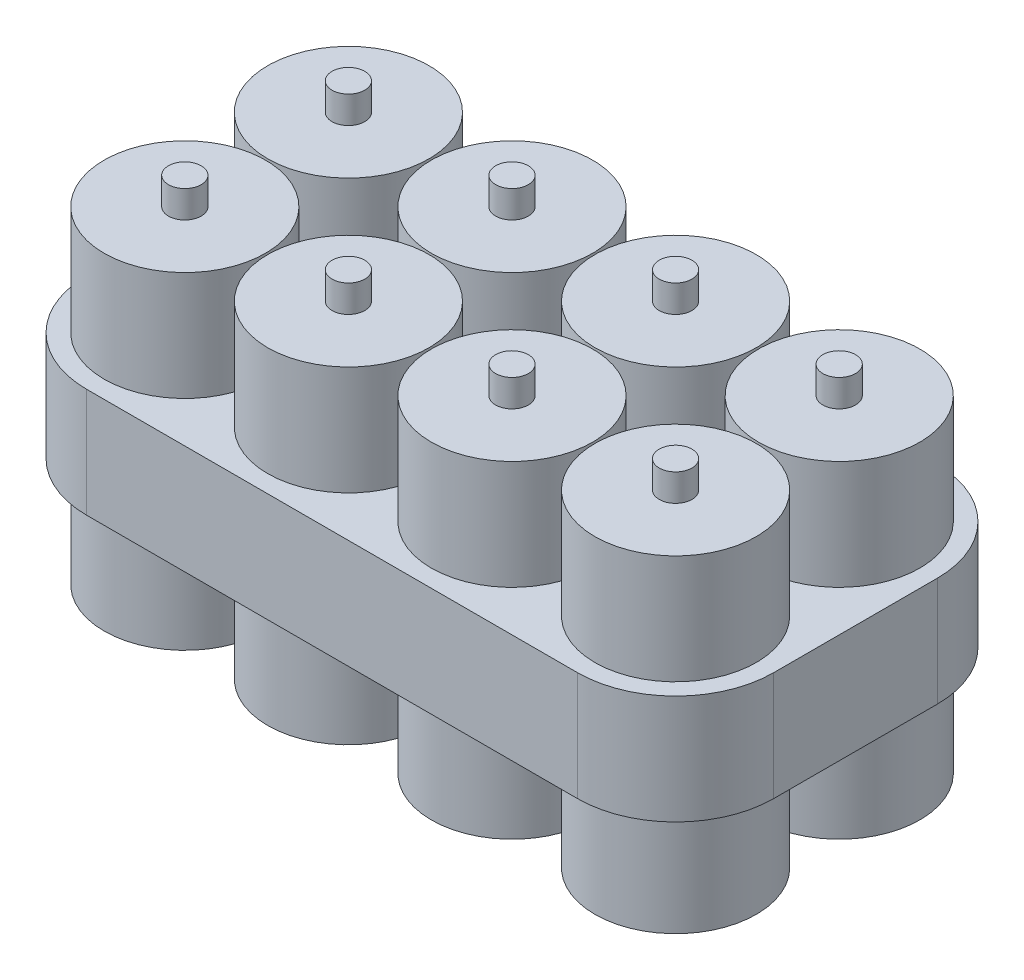
ISO-10303-21;
HEADER;
FILE_DESCRIPTION(('STEP AP214'),'2;1');
FILE_NAME('part.step','',(''),(''),'','','');
FILE_SCHEMA(('AUTOMOTIVE_DESIGN { 1 0 10303 214 1 1 1 1 }'));
ENDSEC;
DATA;
#1=APPLICATION_CONTEXT('core data for automotive mechanical design processes');
#2=APPLICATION_PROTOCOL_DEFINITION('international standard','automotive_design',2000,#1);
#3=PRODUCT_CONTEXT('',#1,'mechanical');
#4=PRODUCT('Part','Part','',(#3));
#5=PRODUCT_RELATED_PRODUCT_CATEGORY('part','',(#4));
#6=PRODUCT_DEFINITION_FORMATION('','',#4);
#7=PRODUCT_DEFINITION_CONTEXT('part definition',#1,'design');
#8=PRODUCT_DEFINITION('design','',#6,#7);
#9=PRODUCT_DEFINITION_SHAPE('','',#8);
#10=(LENGTH_UNIT() NAMED_UNIT(*) SI_UNIT(.MILLI.,.METRE.));
#11=(NAMED_UNIT(*) PLANE_ANGLE_UNIT() SI_UNIT($,.RADIAN.));
#12=(NAMED_UNIT(*) SI_UNIT($,.STERADIAN.) SOLID_ANGLE_UNIT());
#13=UNCERTAINTY_MEASURE_WITH_UNIT(LENGTH_MEASURE(1.E-05),#10,'distance_accuracy_value','');
#14=(GEOMETRIC_REPRESENTATION_CONTEXT(3) GLOBAL_UNCERTAINTY_ASSIGNED_CONTEXT((#13)) GLOBAL_UNIT_ASSIGNED_CONTEXT((#10,
#11,#12)) REPRESENTATION_CONTEXT('',''));
#15=CARTESIAN_POINT('',(0.,0.,0.));
#16=DIRECTION('',(0.,0.,1.));
#17=DIRECTION('',(1.,0.,0.));
#18=AXIS2_PLACEMENT_3D('',#15,#16,#17);
#19=CARTESIAN_POINT('',(0.,40.,0.));
#20=DIRECTION('',(0.,-1.,0.));
#21=DIRECTION('',(0.,0.,-1.));
#22=AXIS2_PLACEMENT_3D('',#19,#20,#21);
#23=CYLINDRICAL_SURFACE('',#22,18.);
#24=CARTESIAN_POINT('',(0.,20.,0.));
#25=DIRECTION('',(0.,1.,0.));
#26=DIRECTION('',(0.,0.,1.));
#27=AXIS2_PLACEMENT_3D('',#24,#25,#26);
#28=CIRCLE('',#27,18.);
#29=CARTESIAN_POINT('',(0.,20.,18.));
#30=VERTEX_POINT('',#29);
#31=CARTESIAN_POINT('',(-18.,20.,1.047339298621E-13));
#32=VERTEX_POINT('',#31);
#33=EDGE_CURVE('E136',#30,#32,#28,.F.);
#34=ORIENTED_EDGE('',*,*,#33,.F.);
#35=DIRECTION('',(0.,-1.,0.));
#36=VECTOR('',#35,1.);
#37=CARTESIAN_POINT('',(0.,40.,18.));
#38=LINE('',#37,#36);
#39=CARTESIAN_POINT('',(0.,40.,18.));
#40=VERTEX_POINT('',#39);
#41=EDGE_CURVE('E95',#40,#30,#38,.T.);
#42=ORIENTED_EDGE('',*,*,#41,.F.);
#43=CARTESIAN_POINT('',(0.,40.,0.));
#44=DIRECTION('',(0.,1.,0.));
#45=DIRECTION('',(0.,0.,1.));
#46=AXIS2_PLACEMENT_3D('',#43,#44,#45);
#47=CIRCLE('',#46,18.);
#48=CARTESIAN_POINT('',(-18.,40.,1.047339298621E-13));
#49=VERTEX_POINT('',#48);
#50=EDGE_CURVE('E156',#40,#49,#47,.F.);
#51=ORIENTED_EDGE('',*,*,#50,.T.);
#52=DIRECTION('',(0.,-1.,0.));
#53=VECTOR('',#52,1.);
#54=CARTESIAN_POINT('',(-18.,40.,1.047339298621E-13));
#55=LINE('',#54,#53);
#56=EDGE_CURVE('E90',#49,#32,#55,.T.);
#57=ORIENTED_EDGE('',*,*,#56,.T.);
#58=EDGE_LOOP('',(#34,#42,#51,#57));
#59=FACE_BOUND('',#58,.T.);
#60=ADVANCED_FACE('F37',(#59),#23,.T.);
#61=CARTESIAN_POINT('',(0.,40.,18.));
#62=DIRECTION('',(0.,0.,-1.));
#63=DIRECTION('',(-1.,0.,0.));
#64=AXIS2_PLACEMENT_3D('',#61,#62,#63);
#65=PLANE('',#64);
#66=DIRECTION('',(1.,0.,0.));
#67=VECTOR('',#66,1.);
#68=CARTESIAN_POINT('',(0.,20.,18.));
#69=LINE('',#68,#67);
#70=CARTESIAN_POINT('',(90.,20.,18.));
#71=VERTEX_POINT('',#70);
#72=EDGE_CURVE('E139',#30,#71,#69,.T.);
#73=ORIENTED_EDGE('',*,*,#72,.T.);
#74=DIRECTION('',(0.,-1.,0.));
#75=VECTOR('',#74,1.);
#76=CARTESIAN_POINT('',(90.,40.,18.));
#77=LINE('',#76,#75);
#78=CARTESIAN_POINT('',(90.,40.,18.));
#79=VERTEX_POINT('',#78);
#80=EDGE_CURVE('E164',#79,#71,#77,.T.);
#81=ORIENTED_EDGE('',*,*,#80,.F.);
#82=DIRECTION('',(1.,0.,0.));
#83=VECTOR('',#82,1.);
#84=CARTESIAN_POINT('',(0.,40.,18.));
#85=LINE('',#84,#83);
#86=EDGE_CURVE('E275',#40,#79,#85,.T.);
#87=ORIENTED_EDGE('',*,*,#86,.F.);
#88=ORIENTED_EDGE('',*,*,#41,.T.);
#89=EDGE_LOOP('',(#73,#81,#87,#88));
#90=FACE_BOUND('',#89,.T.);
#91=ADVANCED_FACE('F296',(#90),#65,.F.);
#92=CARTESIAN_POINT('',(90.,40.,0.));
#93=DIRECTION('',(0.,-1.,0.));
#94=DIRECTION('',(0.,0.,-1.));
#95=AXIS2_PLACEMENT_3D('',#92,#93,#94);
#96=CYLINDRICAL_SURFACE('',#95,18.);
#97=CARTESIAN_POINT('',(90.,20.,0.));
#98=DIRECTION('',(0.,1.,0.));
#99=DIRECTION('',(0.,0.,1.));
#100=AXIS2_PLACEMENT_3D('',#97,#98,#99);
#101=CIRCLE('',#100,18.);
#102=CARTESIAN_POINT('',(108.,20.,0.));
#103=VERTEX_POINT('',#102);
#104=EDGE_CURVE('E143',#103,#71,#101,.F.);
#105=ORIENTED_EDGE('',*,*,#104,.F.);
#106=DIRECTION('',(0.,-1.,0.));
#107=VECTOR('',#106,1.);
#108=CARTESIAN_POINT('',(108.,40.,0.));
#109=LINE('',#108,#107);
#110=CARTESIAN_POINT('',(108.,40.,0.));
#111=VERTEX_POINT('',#110);
#112=EDGE_CURVE('E162',#111,#103,#109,.T.);
#113=ORIENTED_EDGE('',*,*,#112,.F.);
#114=CARTESIAN_POINT('',(90.,40.,0.));
#115=DIRECTION('',(0.,1.,0.));
#116=DIRECTION('',(0.,0.,1.));
#117=AXIS2_PLACEMENT_3D('',#114,#115,#116);
#118=CIRCLE('',#117,18.);
#119=EDGE_CURVE('E277',#111,#79,#118,.F.);
#120=ORIENTED_EDGE('',*,*,#119,.T.);
#121=ORIENTED_EDGE('',*,*,#80,.T.);
#122=EDGE_LOOP('',(#105,#113,#120,#121));
#123=FACE_BOUND('',#122,.T.);
#124=ADVANCED_FACE('F298',(#123),#96,.T.);
#125=CARTESIAN_POINT('',(108.,40.,0.));
#126=DIRECTION('',(1.,0.,0.));
#127=DIRECTION('',(0.,0.,-1.));
#128=AXIS2_PLACEMENT_3D('',#125,#126,#127);
#129=PLANE('',#128);
#130=DIRECTION('',(0.,0.,1.));
#131=VECTOR('',#130,1.);
#132=CARTESIAN_POINT('',(108.,20.,0.));
#133=LINE('',#132,#131);
#134=CARTESIAN_POINT('',(108.,20.,-30.));
#135=VERTEX_POINT('',#134);
#136=EDGE_CURVE('E146',#135,#103,#133,.T.);
#137=ORIENTED_EDGE('',*,*,#136,.F.);
#138=DIRECTION('',(0.,-1.,0.));
#139=VECTOR('',#138,1.);
#140=CARTESIAN_POINT('',(108.,40.,-30.));
#141=LINE('',#140,#139);
#142=CARTESIAN_POINT('',(108.,40.,-30.));
#143=VERTEX_POINT('',#142);
#144=EDGE_CURVE('E160',#143,#135,#141,.T.);
#145=ORIENTED_EDGE('',*,*,#144,.F.);
#146=DIRECTION('',(0.,0.,1.));
#147=VECTOR('',#146,1.);
#148=CARTESIAN_POINT('',(108.,40.,0.));
#149=LINE('',#148,#147);
#150=EDGE_CURVE('E131',#143,#111,#149,.T.);
#151=ORIENTED_EDGE('',*,*,#150,.T.);
#152=ORIENTED_EDGE('',*,*,#112,.T.);
#153=EDGE_LOOP('',(#137,#145,#151,#152));
#154=FACE_BOUND('',#153,.T.);
#155=ADVANCED_FACE('F282',(#154),#129,.T.);
#156=CARTESIAN_POINT('',(90.,40.,-30.));
#157=DIRECTION('',(0.,-1.,0.));
#158=DIRECTION('',(0.,0.,-1.));
#159=AXIS2_PLACEMENT_3D('',#156,#157,#158);
#160=CYLINDRICAL_SURFACE('',#159,18.);
#161=CARTESIAN_POINT('',(90.,20.,-30.));
#162=DIRECTION('',(0.,1.,0.));
#163=DIRECTION('',(0.,0.,1.));
#164=AXIS2_PLACEMENT_3D('',#161,#162,#163);
#165=CIRCLE('',#164,18.);
#166=CARTESIAN_POINT('',(90.,20.,-48.));
#167=VERTEX_POINT('',#166);
#168=EDGE_CURVE('E149',#167,#135,#165,.F.);
#169=ORIENTED_EDGE('',*,*,#168,.F.);
#170=DIRECTION('',(0.,-1.,0.));
#171=VECTOR('',#170,1.);
#172=CARTESIAN_POINT('',(90.,40.,-48.));
#173=LINE('',#172,#171);
#174=CARTESIAN_POINT('',(90.,40.,-48.));
#175=VERTEX_POINT('',#174);
#176=EDGE_CURVE('E119',#175,#167,#173,.T.);
#177=ORIENTED_EDGE('',*,*,#176,.F.);
#178=CARTESIAN_POINT('',(90.,40.,-30.));
#179=DIRECTION('',(0.,1.,0.));
#180=DIRECTION('',(0.,0.,1.));
#181=AXIS2_PLACEMENT_3D('',#178,#179,#180);
#182=CIRCLE('',#181,18.);
#183=EDGE_CURVE('E129',#175,#143,#182,.F.);
#184=ORIENTED_EDGE('',*,*,#183,.T.);
#185=ORIENTED_EDGE('',*,*,#144,.T.);
#186=EDGE_LOOP('',(#169,#177,#184,#185));
#187=FACE_BOUND('',#186,.T.);
#188=ADVANCED_FACE('F287',(#187),#160,.T.);
#189=CARTESIAN_POINT('',(0.,40.,-48.));
#190=DIRECTION('',(0.,0.,-1.));
#191=DIRECTION('',(-1.,0.,0.));
#192=AXIS2_PLACEMENT_3D('',#189,#190,#191);
#193=PLANE('',#192);
#194=DIRECTION('',(1.,0.,0.));
#195=VECTOR('',#194,1.);
#196=CARTESIAN_POINT('',(0.,20.,-48.));
#197=LINE('',#196,#195);
#198=CARTESIAN_POINT('',(0.,20.,-48.));
#199=VERTEX_POINT('',#198);
#200=EDGE_CURVE('E118',#199,#167,#197,.T.);
#201=ORIENTED_EDGE('',*,*,#200,.F.);
#202=DIRECTION('',(0.,-1.,0.));
#203=VECTOR('',#202,1.);
#204=CARTESIAN_POINT('',(0.,40.,-48.));
#205=LINE('',#204,#203);
#206=CARTESIAN_POINT('',(0.,40.,-48.));
#207=VERTEX_POINT('',#206);
#208=EDGE_CURVE('E112',#207,#199,#205,.T.);
#209=ORIENTED_EDGE('',*,*,#208,.F.);
#210=DIRECTION('',(1.,0.,0.));
#211=VECTOR('',#210,1.);
#212=CARTESIAN_POINT('',(0.,40.,-48.));
#213=LINE('',#212,#211);
#214=EDGE_CURVE('E116',#207,#175,#213,.T.);
#215=ORIENTED_EDGE('',*,*,#214,.T.);
#216=ORIENTED_EDGE('',*,*,#176,.T.);
#217=EDGE_LOOP('',(#201,#209,#215,#216));
#218=FACE_BOUND('',#217,.T.);
#219=ADVANCED_FACE('F114',(#218),#193,.T.);
#220=CARTESIAN_POINT('',(0.,40.,-30.));
#221=DIRECTION('',(0.,-1.,0.));
#222=DIRECTION('',(0.,0.,-1.));
#223=AXIS2_PLACEMENT_3D('',#220,#221,#222);
#224=CYLINDRICAL_SURFACE('',#223,18.);
#225=CARTESIAN_POINT('',(0.,20.,-30.));
#226=DIRECTION('',(0.,1.,0.));
#227=DIRECTION('',(0.,0.,1.));
#228=AXIS2_PLACEMENT_3D('',#225,#226,#227);
#229=CIRCLE('',#228,18.);
#230=CARTESIAN_POINT('',(-18.,20.,-30.));
#231=VERTEX_POINT('',#230);
#232=EDGE_CURVE('E83',#199,#231,#229,.T.);
#233=ORIENTED_EDGE('',*,*,#232,.T.);
#234=DIRECTION('',(0.,-1.,0.));
#235=VECTOR('',#234,1.);
#236=CARTESIAN_POINT('',(-18.,40.,-30.));
#237=LINE('',#236,#235);
#238=CARTESIAN_POINT('',(-18.,40.,-30.));
#239=VERTEX_POINT('',#238);
#240=EDGE_CURVE('E120',#239,#231,#237,.T.);
#241=ORIENTED_EDGE('',*,*,#240,.F.);
#242=CARTESIAN_POINT('',(0.,40.,-30.));
#243=DIRECTION('',(0.,1.,0.));
#244=DIRECTION('',(0.,0.,1.));
#245=AXIS2_PLACEMENT_3D('',#242,#243,#244);
#246=CIRCLE('',#245,18.);
#247=EDGE_CURVE('E122',#207,#239,#246,.T.);
#248=ORIENTED_EDGE('',*,*,#247,.F.);
#249=ORIENTED_EDGE('',*,*,#208,.T.);
#250=EDGE_LOOP('',(#233,#241,#248,#249));
#251=FACE_BOUND('',#250,.T.);
#252=ADVANCED_FACE('F123',(#251),#224,.T.);
#253=CARTESIAN_POINT('',(-18.,40.,0.));
#254=DIRECTION('',(1.,0.,0.));
#255=DIRECTION('',(0.,0.,-1.));
#256=AXIS2_PLACEMENT_3D('',#253,#254,#255);
#257=PLANE('',#256);
#258=DIRECTION('',(0.,0.,1.));
#259=VECTOR('',#258,1.);
#260=CARTESIAN_POINT('',(-18.,20.,0.));
#261=LINE('',#260,#259);
#262=EDGE_CURVE('E154',#231,#32,#261,.T.);
#263=ORIENTED_EDGE('',*,*,#262,.T.);
#264=ORIENTED_EDGE('',*,*,#56,.F.);
#265=DIRECTION('',(0.,0.,1.));
#266=VECTOR('',#265,1.);
#267=CARTESIAN_POINT('',(-18.,40.,0.));
#268=LINE('',#267,#266);
#269=EDGE_CURVE('E55',#239,#49,#268,.T.);
#270=ORIENTED_EDGE('',*,*,#269,.F.);
#271=ORIENTED_EDGE('',*,*,#240,.T.);
#272=EDGE_LOOP('',(#263,#264,#270,#271));
#273=FACE_BOUND('',#272,.T.);
#274=ADVANCED_FACE('F293',(#273),#257,.F.);
#275=CARTESIAN_POINT('',(0.,40.,0.));
#276=DIRECTION('',(0.,1.,0.));
#277=DIRECTION('',(0.,0.,1.));
#278=AXIS2_PLACEMENT_3D('',#275,#276,#277);
#279=PLANE('',#278);
#280=CARTESIAN_POINT('',(0.,40.,0.));
#281=DIRECTION('',(0.,1.,0.));
#282=DIRECTION('',(0.,0.,1.));
#283=AXIS2_PLACEMENT_3D('',#280,#281,#282);
#284=CIRCLE('',#283,14.8);
#285=CARTESIAN_POINT('',(0.,40.,14.8));
#286=VERTEX_POINT('',#285);
#287=EDGE_CURVE('E206',#286,#286,#284,.F.);
#288=ORIENTED_EDGE('',*,*,#287,.T.);
#289=EDGE_LOOP('',(#288));
#290=FACE_BOUND('',#289,.T.);
#291=CARTESIAN_POINT('',(30.,40.,0.));
#292=DIRECTION('',(0.,1.,0.));
#293=DIRECTION('',(0.,0.,1.));
#294=AXIS2_PLACEMENT_3D('',#291,#292,#293);
#295=CIRCLE('',#294,14.8);
#296=CARTESIAN_POINT('',(30.,40.,14.8));
#297=VERTEX_POINT('',#296);
#298=EDGE_CURVE('E216',#297,#297,#295,.F.);
#299=ORIENTED_EDGE('',*,*,#298,.T.);
#300=EDGE_LOOP('',(#299));
#301=FACE_BOUND('',#300,.T.);
#302=CARTESIAN_POINT('',(60.,40.,0.));
#303=DIRECTION('',(0.,1.,0.));
#304=DIRECTION('',(0.,0.,1.));
#305=AXIS2_PLACEMENT_3D('',#302,#303,#304);
#306=CIRCLE('',#305,14.8);
#307=CARTESIAN_POINT('',(60.,40.,14.8));
#308=VERTEX_POINT('',#307);
#309=EDGE_CURVE('E225',#308,#308,#306,.F.);
#310=ORIENTED_EDGE('',*,*,#309,.T.);
#311=EDGE_LOOP('',(#310));
#312=FACE_BOUND('',#311,.T.);
#313=CARTESIAN_POINT('',(90.,40.,0.));
#314=DIRECTION('',(0.,1.,0.));
#315=DIRECTION('',(0.,0.,1.));
#316=AXIS2_PLACEMENT_3D('',#313,#314,#315);
#317=CIRCLE('',#316,14.8);
#318=CARTESIAN_POINT('',(90.,40.,14.8));
#319=VERTEX_POINT('',#318);
#320=EDGE_CURVE('E234',#319,#319,#317,.F.);
#321=ORIENTED_EDGE('',*,*,#320,.T.);
#322=EDGE_LOOP('',(#321));
#323=FACE_BOUND('',#322,.T.);
#324=CARTESIAN_POINT('',(90.,40.,-30.));
#325=DIRECTION('',(0.,1.,0.));
#326=DIRECTION('',(0.,0.,1.));
#327=AXIS2_PLACEMENT_3D('',#324,#325,#326);
#328=CIRCLE('',#327,14.8);
#329=CARTESIAN_POINT('',(90.,40.,-15.2));
#330=VERTEX_POINT('',#329);
#331=EDGE_CURVE('E243',#330,#330,#328,.F.);
#332=ORIENTED_EDGE('',*,*,#331,.T.);
#333=EDGE_LOOP('',(#332));
#334=FACE_BOUND('',#333,.T.);
#335=CARTESIAN_POINT('',(60.,40.,-30.));
#336=DIRECTION('',(0.,1.,0.));
#337=DIRECTION('',(0.,0.,1.));
#338=AXIS2_PLACEMENT_3D('',#335,#336,#337);
#339=CIRCLE('',#338,14.8);
#340=CARTESIAN_POINT('',(60.,40.,-15.2));
#341=VERTEX_POINT('',#340);
#342=EDGE_CURVE('E252',#341,#341,#339,.F.);
#343=ORIENTED_EDGE('',*,*,#342,.T.);
#344=EDGE_LOOP('',(#343));
#345=FACE_BOUND('',#344,.T.);
#346=CARTESIAN_POINT('',(30.,40.,-30.));
#347=DIRECTION('',(0.,1.,0.));
#348=DIRECTION('',(0.,0.,1.));
#349=AXIS2_PLACEMENT_3D('',#346,#347,#348);
#350=CIRCLE('',#349,14.8);
#351=CARTESIAN_POINT('',(30.,40.,-15.2));
#352=VERTEX_POINT('',#351);
#353=EDGE_CURVE('E261',#352,#352,#350,.F.);
#354=ORIENTED_EDGE('',*,*,#353,.T.);
#355=EDGE_LOOP('',(#354));
#356=FACE_BOUND('',#355,.T.);
#357=CARTESIAN_POINT('',(0.,40.,-30.));
#358=DIRECTION('',(0.,1.,0.));
#359=DIRECTION('',(0.,0.,1.));
#360=AXIS2_PLACEMENT_3D('',#357,#358,#359);
#361=CIRCLE('',#360,14.8);
#362=CARTESIAN_POINT('',(0.,40.,-15.2));
#363=VERTEX_POINT('',#362);
#364=EDGE_CURVE('E140',#363,#363,#361,.F.);
#365=ORIENTED_EDGE('',*,*,#364,.T.);
#366=EDGE_LOOP('',(#365));
#367=FACE_BOUND('',#366,.T.);
#368=ORIENTED_EDGE('',*,*,#50,.F.);
#369=ORIENTED_EDGE('',*,*,#86,.T.);
#370=ORIENTED_EDGE('',*,*,#119,.F.);
#371=ORIENTED_EDGE('',*,*,#150,.F.);
#372=ORIENTED_EDGE('',*,*,#183,.F.);
#373=ORIENTED_EDGE('',*,*,#214,.F.);
#374=ORIENTED_EDGE('',*,*,#247,.T.);
#375=ORIENTED_EDGE('',*,*,#269,.T.);
#376=EDGE_LOOP('',(#368,#369,#370,#371,#372,#373,#374,#375));
#377=FACE_BOUND('',#376,.T.);
#378=ADVANCED_FACE('F126',(#290,#301,#312,#323,#334,#345,#356,#367,#377),#279,.T.);
#379=CARTESIAN_POINT('',(0.,20.,0.));
#380=DIRECTION('',(0.,1.,0.));
#381=DIRECTION('',(0.,0.,1.));
#382=AXIS2_PLACEMENT_3D('',#379,#380,#381);
#383=PLANE('',#382);
#384=CARTESIAN_POINT('',(0.,20.,0.));
#385=DIRECTION('',(0.,1.,0.));
#386=DIRECTION('',(0.,0.,1.));
#387=AXIS2_PLACEMENT_3D('',#384,#385,#386);
#388=CIRCLE('',#387,14.8);
#389=CARTESIAN_POINT('',(0.,20.,14.8));
#390=VERTEX_POINT('',#389);
#391=EDGE_CURVE('E40',#390,#390,#388,.F.);
#392=ORIENTED_EDGE('',*,*,#391,.F.);
#393=EDGE_LOOP('',(#392));
#394=FACE_BOUND('',#393,.T.);
#395=CARTESIAN_POINT('',(30.,20.,0.));
#396=DIRECTION('',(0.,1.,0.));
#397=DIRECTION('',(0.,0.,1.));
#398=AXIS2_PLACEMENT_3D('',#395,#396,#397);
#399=CIRCLE('',#398,14.8);
#400=CARTESIAN_POINT('',(30.,20.,14.8));
#401=VERTEX_POINT('',#400);
#402=EDGE_CURVE('E184',#401,#401,#399,.F.);
#403=ORIENTED_EDGE('',*,*,#402,.F.);
#404=EDGE_LOOP('',(#403));
#405=FACE_BOUND('',#404,.T.);
#406=CARTESIAN_POINT('',(60.,20.,0.));
#407=DIRECTION('',(0.,1.,0.));
#408=DIRECTION('',(0.,0.,1.));
#409=AXIS2_PLACEMENT_3D('',#406,#407,#408);
#410=CIRCLE('',#409,14.8);
#411=CARTESIAN_POINT('',(60.,20.,14.8));
#412=VERTEX_POINT('',#411);
#413=EDGE_CURVE('E182',#412,#412,#410,.F.);
#414=ORIENTED_EDGE('',*,*,#413,.F.);
#415=EDGE_LOOP('',(#414));
#416=FACE_BOUND('',#415,.T.);
#417=CARTESIAN_POINT('',(90.,20.,0.));
#418=DIRECTION('',(0.,1.,0.));
#419=DIRECTION('',(0.,0.,1.));
#420=AXIS2_PLACEMENT_3D('',#417,#418,#419);
#421=CIRCLE('',#420,14.8);
#422=CARTESIAN_POINT('',(90.,20.,14.8));
#423=VERTEX_POINT('',#422);
#424=EDGE_CURVE('E179',#423,#423,#421,.F.);
#425=ORIENTED_EDGE('',*,*,#424,.F.);
#426=EDGE_LOOP('',(#425));
#427=FACE_BOUND('',#426,.T.);
#428=CARTESIAN_POINT('',(90.,20.,-30.));
#429=DIRECTION('',(0.,1.,0.));
#430=DIRECTION('',(0.,0.,1.));
#431=AXIS2_PLACEMENT_3D('',#428,#429,#430);
#432=CIRCLE('',#431,14.8);
#433=CARTESIAN_POINT('',(90.,20.,-15.2));
#434=VERTEX_POINT('',#433);
#435=EDGE_CURVE('E176',#434,#434,#432,.F.);
#436=ORIENTED_EDGE('',*,*,#435,.F.);
#437=EDGE_LOOP('',(#436));
#438=FACE_BOUND('',#437,.T.);
#439=CARTESIAN_POINT('',(60.,20.,-30.));
#440=DIRECTION('',(0.,1.,0.));
#441=DIRECTION('',(0.,0.,1.));
#442=AXIS2_PLACEMENT_3D('',#439,#440,#441);
#443=CIRCLE('',#442,14.8);
#444=CARTESIAN_POINT('',(60.,20.,-15.2));
#445=VERTEX_POINT('',#444);
#446=EDGE_CURVE('E173',#445,#445,#443,.F.);
#447=ORIENTED_EDGE('',*,*,#446,.F.);
#448=EDGE_LOOP('',(#447));
#449=FACE_BOUND('',#448,.T.);
#450=CARTESIAN_POINT('',(30.,20.,-30.));
#451=DIRECTION('',(0.,1.,0.));
#452=DIRECTION('',(0.,0.,1.));
#453=AXIS2_PLACEMENT_3D('',#450,#451,#452);
#454=CIRCLE('',#453,14.8);
#455=CARTESIAN_POINT('',(30.,20.,-15.2));
#456=VERTEX_POINT('',#455);
#457=EDGE_CURVE('E170',#456,#456,#454,.F.);
#458=ORIENTED_EDGE('',*,*,#457,.F.);
#459=EDGE_LOOP('',(#458));
#460=FACE_BOUND('',#459,.T.);
#461=CARTESIAN_POINT('',(0.,20.,-30.));
#462=DIRECTION('',(0.,1.,0.));
#463=DIRECTION('',(0.,0.,1.));
#464=AXIS2_PLACEMENT_3D('',#461,#462,#463);
#465=CIRCLE('',#464,14.8);
#466=CARTESIAN_POINT('',(0.,20.,-15.2));
#467=VERTEX_POINT('',#466);
#468=EDGE_CURVE('E167',#467,#467,#465,.F.);
#469=ORIENTED_EDGE('',*,*,#468,.F.);
#470=EDGE_LOOP('',(#469));
#471=FACE_BOUND('',#470,.T.);
#472=ORIENTED_EDGE('',*,*,#33,.T.);
#473=ORIENTED_EDGE('',*,*,#262,.F.);
#474=ORIENTED_EDGE('',*,*,#232,.F.);
#475=ORIENTED_EDGE('',*,*,#200,.T.);
#476=ORIENTED_EDGE('',*,*,#168,.T.);
#477=ORIENTED_EDGE('',*,*,#136,.T.);
#478=ORIENTED_EDGE('',*,*,#104,.T.);
#479=ORIENTED_EDGE('',*,*,#72,.F.);
#480=EDGE_LOOP('',(#472,#473,#474,#475,#476,#477,#478,#479));
#481=FACE_BOUND('',#480,.T.);
#482=ADVANCED_FACE('F289',(#394,#405,#416,#427,#438,#449,#460,#471,#481),#383,.F.);
#483=CARTESIAN_POINT('',(0.,0.,0.));
#484=DIRECTION('',(0.,1.,0.));
#485=DIRECTION('',(0.,0.,1.));
#486=AXIS2_PLACEMENT_3D('',#483,#484,#485);
#487=PLANE('',#486);
#488=CARTESIAN_POINT('',(0.,0.,-30.));
#489=DIRECTION('',(0.,1.,0.));
#490=DIRECTION('',(0.,0.,1.));
#491=AXIS2_PLACEMENT_3D('',#488,#489,#490);
#492=CIRCLE('',#491,14.8);
#493=CARTESIAN_POINT('',(0.,0.,-15.2));
#494=VERTEX_POINT('',#493);
#495=EDGE_CURVE('E266',#494,#494,#492,.T.);
#496=ORIENTED_EDGE('',*,*,#495,.F.);
#497=EDGE_LOOP('',(#496));
#498=FACE_BOUND('',#497,.T.);
#499=ADVANCED_FACE('F373',(#498),#487,.F.);
#500=CARTESIAN_POINT('',(0.,60.,-30.));
#501=DIRECTION('',(0.,-1.,0.));
#502=DIRECTION('',(0.,0.,-1.));
#503=AXIS2_PLACEMENT_3D('',#500,#501,#502);
#504=CYLINDRICAL_SURFACE('',#503,14.8);
#505=ORIENTED_EDGE('',*,*,#495,.T.);
#506=EDGE_LOOP('',(#505));
#507=FACE_BOUND('',#506,.T.);
#508=ORIENTED_EDGE('',*,*,#468,.T.);
#509=EDGE_LOOP('',(#508));
#510=FACE_BOUND('',#509,.T.);
#511=ADVANCED_FACE('F383',(#507,#510),#504,.T.);
#512=ORIENTED_EDGE('',*,*,#364,.F.);
#513=EDGE_LOOP('',(#512));
#514=FACE_BOUND('',#513,.T.);
#515=CARTESIAN_POINT('',(0.,60.,-30.));
#516=DIRECTION('',(0.,1.,0.));
#517=DIRECTION('',(0.,0.,1.));
#518=AXIS2_PLACEMENT_3D('',#515,#516,#517);
#519=CIRCLE('',#518,14.8);
#520=CARTESIAN_POINT('',(0.,60.,-15.2));
#521=VERTEX_POINT('',#520);
#522=EDGE_CURVE('E267',#521,#521,#519,.T.);
#523=ORIENTED_EDGE('',*,*,#522,.F.);
#524=EDGE_LOOP('',(#523));
#525=FACE_BOUND('',#524,.T.);
#526=ADVANCED_FACE('F393',(#514,#525),#504,.T.);
#527=CARTESIAN_POINT('',(0.,60.,0.));
#528=DIRECTION('',(0.,1.,0.));
#529=DIRECTION('',(0.,0.,1.));
#530=AXIS2_PLACEMENT_3D('',#527,#528,#529);
#531=PLANE('',#530);
#532=CARTESIAN_POINT('',(0.,60.,-30.));
#533=DIRECTION('',(0.,1.,0.));
#534=DIRECTION('',(0.,0.,1.));
#535=AXIS2_PLACEMENT_3D('',#532,#533,#534);
#536=CIRCLE('',#535,3.);
#537=CARTESIAN_POINT('',(0.,60.,-27.));
#538=VERTEX_POINT('',#537);
#539=EDGE_CURVE('E189',#538,#538,#536,.T.);
#540=ORIENTED_EDGE('',*,*,#539,.F.);
#541=EDGE_LOOP('',(#540));
#542=FACE_BOUND('',#541,.T.);
#543=ORIENTED_EDGE('',*,*,#522,.T.);
#544=EDGE_LOOP('',(#543));
#545=FACE_BOUND('',#544,.T.);
#546=ADVANCED_FACE('F403',(#542,#545),#531,.T.);
#547=CARTESIAN_POINT('',(0.,0.,0.));
#548=DIRECTION('',(0.,1.,0.));
#549=DIRECTION('',(0.,0.,1.));
#550=AXIS2_PLACEMENT_3D('',#547,#548,#549);
#551=PLANE('',#550);
#552=CARTESIAN_POINT('',(30.,0.,-30.));
#553=DIRECTION('',(0.,1.,0.));
#554=DIRECTION('',(0.,0.,1.));
#555=AXIS2_PLACEMENT_3D('',#552,#553,#554);
#556=CIRCLE('',#555,14.8);
#557=CARTESIAN_POINT('',(30.,0.,-15.2));
#558=VERTEX_POINT('',#557);
#559=EDGE_CURVE('E257',#558,#558,#556,.T.);
#560=ORIENTED_EDGE('',*,*,#559,.F.);
#561=EDGE_LOOP('',(#560));
#562=FACE_BOUND('',#561,.T.);
#563=ADVANCED_FACE('F410',(#562),#551,.F.);
#564=CARTESIAN_POINT('',(30.,60.,-30.));
#565=DIRECTION('',(0.,-1.,0.));
#566=DIRECTION('',(0.,0.,-1.));
#567=AXIS2_PLACEMENT_3D('',#564,#565,#566);
#568=CYLINDRICAL_SURFACE('',#567,14.8);
#569=ORIENTED_EDGE('',*,*,#559,.T.);
#570=EDGE_LOOP('',(#569));
#571=FACE_BOUND('',#570,.T.);
#572=ORIENTED_EDGE('',*,*,#457,.T.);
#573=EDGE_LOOP('',(#572));
#574=FACE_BOUND('',#573,.T.);
#575=ADVANCED_FACE('F415',(#571,#574),#568,.T.);
#576=ORIENTED_EDGE('',*,*,#353,.F.);
#577=EDGE_LOOP('',(#576));
#578=FACE_BOUND('',#577,.T.);
#579=CARTESIAN_POINT('',(30.,60.,-30.));
#580=DIRECTION('',(0.,1.,0.));
#581=DIRECTION('',(0.,0.,1.));
#582=AXIS2_PLACEMENT_3D('',#579,#580,#581);
#583=CIRCLE('',#582,14.8);
#584=CARTESIAN_POINT('',(30.,60.,-15.2));
#585=VERTEX_POINT('',#584);
#586=EDGE_CURVE('E258',#585,#585,#583,.T.);
#587=ORIENTED_EDGE('',*,*,#586,.F.);
#588=EDGE_LOOP('',(#587));
#589=FACE_BOUND('',#588,.T.);
#590=ADVANCED_FACE('F425',(#578,#589),#568,.T.);
#591=CARTESIAN_POINT('',(0.,60.,0.));
#592=DIRECTION('',(0.,1.,0.));
#593=DIRECTION('',(0.,0.,1.));
#594=AXIS2_PLACEMENT_3D('',#591,#592,#593);
#595=PLANE('',#594);
#596=CARTESIAN_POINT('',(30.,60.,-30.));
#597=DIRECTION('',(0.,1.,0.));
#598=DIRECTION('',(0.,0.,1.));
#599=AXIS2_PLACEMENT_3D('',#596,#597,#598);
#600=CIRCLE('',#599,3.);
#601=CARTESIAN_POINT('',(30.,60.,-27.));
#602=VERTEX_POINT('',#601);
#603=EDGE_CURVE('E193',#602,#602,#600,.T.);
#604=ORIENTED_EDGE('',*,*,#603,.F.);
#605=EDGE_LOOP('',(#604));
#606=FACE_BOUND('',#605,.T.);
#607=ORIENTED_EDGE('',*,*,#586,.T.);
#608=EDGE_LOOP('',(#607));
#609=FACE_BOUND('',#608,.T.);
#610=ADVANCED_FACE('F435',(#606,#609),#595,.T.);
#611=CARTESIAN_POINT('',(0.,0.,0.));
#612=DIRECTION('',(0.,1.,0.));
#613=DIRECTION('',(0.,0.,1.));
#614=AXIS2_PLACEMENT_3D('',#611,#612,#613);
#615=PLANE('',#614);
#616=CARTESIAN_POINT('',(60.,0.,-30.));
#617=DIRECTION('',(0.,1.,0.));
#618=DIRECTION('',(0.,0.,1.));
#619=AXIS2_PLACEMENT_3D('',#616,#617,#618);
#620=CIRCLE('',#619,14.8);
#621=CARTESIAN_POINT('',(60.,0.,-15.2));
#622=VERTEX_POINT('',#621);
#623=EDGE_CURVE('E248',#622,#622,#620,.T.);
#624=ORIENTED_EDGE('',*,*,#623,.F.);
#625=EDGE_LOOP('',(#624));
#626=FACE_BOUND('',#625,.T.);
#627=ADVANCED_FACE('F442',(#626),#615,.F.);
#628=CARTESIAN_POINT('',(60.,60.,-30.));
#629=DIRECTION('',(0.,-1.,0.));
#630=DIRECTION('',(0.,0.,-1.));
#631=AXIS2_PLACEMENT_3D('',#628,#629,#630);
#632=CYLINDRICAL_SURFACE('',#631,14.8);
#633=ORIENTED_EDGE('',*,*,#623,.T.);
#634=EDGE_LOOP('',(#633));
#635=FACE_BOUND('',#634,.T.);
#636=ORIENTED_EDGE('',*,*,#446,.T.);
#637=EDGE_LOOP('',(#636));
#638=FACE_BOUND('',#637,.T.);
#639=ADVANCED_FACE('F447',(#635,#638),#632,.T.);
#640=ORIENTED_EDGE('',*,*,#342,.F.);
#641=EDGE_LOOP('',(#640));
#642=FACE_BOUND('',#641,.T.);
#643=CARTESIAN_POINT('',(60.,60.,-30.));
#644=DIRECTION('',(0.,1.,0.));
#645=DIRECTION('',(0.,0.,1.));
#646=AXIS2_PLACEMENT_3D('',#643,#644,#645);
#647=CIRCLE('',#646,14.8);
#648=CARTESIAN_POINT('',(60.,60.,-15.2));
#649=VERTEX_POINT('',#648);
#650=EDGE_CURVE('E249',#649,#649,#647,.T.);
#651=ORIENTED_EDGE('',*,*,#650,.F.);
#652=EDGE_LOOP('',(#651));
#653=FACE_BOUND('',#652,.T.);
#654=ADVANCED_FACE('F457',(#642,#653),#632,.T.);
#655=CARTESIAN_POINT('',(0.,60.,0.));
#656=DIRECTION('',(0.,1.,0.));
#657=DIRECTION('',(0.,0.,1.));
#658=AXIS2_PLACEMENT_3D('',#655,#656,#657);
#659=PLANE('',#658);
#660=CARTESIAN_POINT('',(60.,60.,-30.));
#661=DIRECTION('',(0.,1.,0.));
#662=DIRECTION('',(0.,0.,1.));
#663=AXIS2_PLACEMENT_3D('',#660,#661,#662);
#664=CIRCLE('',#663,3.00000000000001);
#665=CARTESIAN_POINT('',(60.,60.,-27.));
#666=VERTEX_POINT('',#665);
#667=EDGE_CURVE('E198',#666,#666,#664,.T.);
#668=ORIENTED_EDGE('',*,*,#667,.F.);
#669=EDGE_LOOP('',(#668));
#670=FACE_BOUND('',#669,.T.);
#671=ORIENTED_EDGE('',*,*,#650,.T.);
#672=EDGE_LOOP('',(#671));
#673=FACE_BOUND('',#672,.T.);
#674=ADVANCED_FACE('F467',(#670,#673),#659,.T.);
#675=CARTESIAN_POINT('',(0.,0.,0.));
#676=DIRECTION('',(0.,1.,0.));
#677=DIRECTION('',(0.,0.,1.));
#678=AXIS2_PLACEMENT_3D('',#675,#676,#677);
#679=PLANE('',#678);
#680=CARTESIAN_POINT('',(90.,0.,-30.));
#681=DIRECTION('',(0.,1.,0.));
#682=DIRECTION('',(0.,0.,1.));
#683=AXIS2_PLACEMENT_3D('',#680,#681,#682);
#684=CIRCLE('',#683,14.8);
#685=CARTESIAN_POINT('',(90.,0.,-15.2));
#686=VERTEX_POINT('',#685);
#687=EDGE_CURVE('E239',#686,#686,#684,.T.);
#688=ORIENTED_EDGE('',*,*,#687,.F.);
#689=EDGE_LOOP('',(#688));
#690=FACE_BOUND('',#689,.T.);
#691=ADVANCED_FACE('F474',(#690),#679,.F.);
#692=CARTESIAN_POINT('',(90.,60.,-30.));
#693=DIRECTION('',(0.,-1.,0.));
#694=DIRECTION('',(0.,0.,-1.));
#695=AXIS2_PLACEMENT_3D('',#692,#693,#694);
#696=CYLINDRICAL_SURFACE('',#695,14.8);
#697=ORIENTED_EDGE('',*,*,#687,.T.);
#698=EDGE_LOOP('',(#697));
#699=FACE_BOUND('',#698,.T.);
#700=ORIENTED_EDGE('',*,*,#435,.T.);
#701=EDGE_LOOP('',(#700));
#702=FACE_BOUND('',#701,.T.);
#703=ADVANCED_FACE('F479',(#699,#702),#696,.T.);
#704=ORIENTED_EDGE('',*,*,#331,.F.);
#705=EDGE_LOOP('',(#704));
#706=FACE_BOUND('',#705,.T.);
#707=CARTESIAN_POINT('',(90.,60.,-30.));
#708=DIRECTION('',(0.,1.,0.));
#709=DIRECTION('',(0.,0.,1.));
#710=AXIS2_PLACEMENT_3D('',#707,#708,#709);
#711=CIRCLE('',#710,14.8);
#712=CARTESIAN_POINT('',(90.,60.,-15.2));
#713=VERTEX_POINT('',#712);
#714=EDGE_CURVE('E240',#713,#713,#711,.T.);
#715=ORIENTED_EDGE('',*,*,#714,.F.);
#716=EDGE_LOOP('',(#715));
#717=FACE_BOUND('',#716,.T.);
#718=ADVANCED_FACE('F489',(#706,#717),#696,.T.);
#719=CARTESIAN_POINT('',(0.,60.,0.));
#720=DIRECTION('',(0.,1.,0.));
#721=DIRECTION('',(0.,0.,1.));
#722=AXIS2_PLACEMENT_3D('',#719,#720,#721);
#723=PLANE('',#722);
#724=CARTESIAN_POINT('',(90.,60.,-30.));
#725=DIRECTION('',(0.,1.,0.));
#726=DIRECTION('',(0.,0.,1.));
#727=AXIS2_PLACEMENT_3D('',#724,#725,#726);
#728=CIRCLE('',#727,3.00000000000001);
#729=CARTESIAN_POINT('',(90.,60.,-27.));
#730=VERTEX_POINT('',#729);
#731=EDGE_CURVE('E872',#730,#730,#728,.T.);
#732=ORIENTED_EDGE('',*,*,#731,.F.);
#733=EDGE_LOOP('',(#732));
#734=FACE_BOUND('',#733,.T.);
#735=ORIENTED_EDGE('',*,*,#714,.T.);
#736=EDGE_LOOP('',(#735));
#737=FACE_BOUND('',#736,.T.);
#738=ADVANCED_FACE('F499',(#734,#737),#723,.T.);
#739=CARTESIAN_POINT('',(0.,0.,0.));
#740=DIRECTION('',(0.,1.,0.));
#741=DIRECTION('',(0.,0.,1.));
#742=AXIS2_PLACEMENT_3D('',#739,#740,#741);
#743=PLANE('',#742);
#744=CARTESIAN_POINT('',(90.,0.,0.));
#745=DIRECTION('',(0.,1.,0.));
#746=DIRECTION('',(0.,0.,1.));
#747=AXIS2_PLACEMENT_3D('',#744,#745,#746);
#748=CIRCLE('',#747,14.8);
#749=CARTESIAN_POINT('',(90.,0.,14.8));
#750=VERTEX_POINT('',#749);
#751=EDGE_CURVE('E230',#750,#750,#748,.T.);
#752=ORIENTED_EDGE('',*,*,#751,.F.);
#753=EDGE_LOOP('',(#752));
#754=FACE_BOUND('',#753,.T.);
#755=ADVANCED_FACE('F506',(#754),#743,.F.);
#756=CARTESIAN_POINT('',(90.,60.,0.));
#757=DIRECTION('',(0.,-1.,0.));
#758=DIRECTION('',(0.,0.,-1.));
#759=AXIS2_PLACEMENT_3D('',#756,#757,#758);
#760=CYLINDRICAL_SURFACE('',#759,14.8);
#761=ORIENTED_EDGE('',*,*,#751,.T.);
#762=EDGE_LOOP('',(#761));
#763=FACE_BOUND('',#762,.T.);
#764=ORIENTED_EDGE('',*,*,#424,.T.);
#765=EDGE_LOOP('',(#764));
#766=FACE_BOUND('',#765,.T.);
#767=ADVANCED_FACE('F511',(#763,#766),#760,.T.);
#768=ORIENTED_EDGE('',*,*,#320,.F.);
#769=EDGE_LOOP('',(#768));
#770=FACE_BOUND('',#769,.T.);
#771=CARTESIAN_POINT('',(90.,60.,0.));
#772=DIRECTION('',(0.,1.,0.));
#773=DIRECTION('',(0.,0.,1.));
#774=AXIS2_PLACEMENT_3D('',#771,#772,#773);
#775=CIRCLE('',#774,14.8);
#776=CARTESIAN_POINT('',(90.,60.,14.8));
#777=VERTEX_POINT('',#776);
#778=EDGE_CURVE('E231',#777,#777,#775,.T.);
#779=ORIENTED_EDGE('',*,*,#778,.F.);
#780=EDGE_LOOP('',(#779));
#781=FACE_BOUND('',#780,.T.);
#782=ADVANCED_FACE('F521',(#770,#781),#760,.T.);
#783=CARTESIAN_POINT('',(0.,60.,0.));
#784=DIRECTION('',(0.,1.,0.));
#785=DIRECTION('',(0.,0.,1.));
#786=AXIS2_PLACEMENT_3D('',#783,#784,#785);
#787=PLANE('',#786);
#788=CARTESIAN_POINT('',(90.,60.,0.));
#789=DIRECTION('',(0.,1.,0.));
#790=DIRECTION('',(0.,0.,1.));
#791=AXIS2_PLACEMENT_3D('',#788,#789,#790);
#792=CIRCLE('',#791,3.00000000000001);
#793=CARTESIAN_POINT('',(90.,60.,3.00000000000001));
#794=VERTEX_POINT('',#793);
#795=EDGE_CURVE('E11',#794,#794,#792,.T.);
#796=ORIENTED_EDGE('',*,*,#795,.F.);
#797=EDGE_LOOP('',(#796));
#798=FACE_BOUND('',#797,.T.);
#799=ORIENTED_EDGE('',*,*,#778,.T.);
#800=EDGE_LOOP('',(#799));
#801=FACE_BOUND('',#800,.T.);
#802=ADVANCED_FACE('F531',(#798,#801),#787,.T.);
#803=CARTESIAN_POINT('',(0.,0.,0.));
#804=DIRECTION('',(0.,1.,0.));
#805=DIRECTION('',(0.,0.,1.));
#806=AXIS2_PLACEMENT_3D('',#803,#804,#805);
#807=PLANE('',#806);
#808=CARTESIAN_POINT('',(60.,0.,0.));
#809=DIRECTION('',(0.,1.,0.));
#810=DIRECTION('',(0.,0.,1.));
#811=AXIS2_PLACEMENT_3D('',#808,#809,#810);
#812=CIRCLE('',#811,14.8);
#813=CARTESIAN_POINT('',(60.,0.,14.8));
#814=VERTEX_POINT('',#813);
#815=EDGE_CURVE('E221',#814,#814,#812,.T.);
#816=ORIENTED_EDGE('',*,*,#815,.F.);
#817=EDGE_LOOP('',(#816));
#818=FACE_BOUND('',#817,.T.);
#819=ADVANCED_FACE('F538',(#818),#807,.F.);
#820=CARTESIAN_POINT('',(60.,60.,0.));
#821=DIRECTION('',(0.,-1.,0.));
#822=DIRECTION('',(0.,0.,-1.));
#823=AXIS2_PLACEMENT_3D('',#820,#821,#822);
#824=CYLINDRICAL_SURFACE('',#823,14.8);
#825=ORIENTED_EDGE('',*,*,#815,.T.);
#826=EDGE_LOOP('',(#825));
#827=FACE_BOUND('',#826,.T.);
#828=ORIENTED_EDGE('',*,*,#413,.T.);
#829=EDGE_LOOP('',(#828));
#830=FACE_BOUND('',#829,.T.);
#831=ADVANCED_FACE('F543',(#827,#830),#824,.T.);
#832=ORIENTED_EDGE('',*,*,#309,.F.);
#833=EDGE_LOOP('',(#832));
#834=FACE_BOUND('',#833,.T.);
#835=CARTESIAN_POINT('',(60.,60.,0.));
#836=DIRECTION('',(0.,1.,0.));
#837=DIRECTION('',(0.,0.,1.));
#838=AXIS2_PLACEMENT_3D('',#835,#836,#837);
#839=CIRCLE('',#838,14.8);
#840=CARTESIAN_POINT('',(60.,60.,14.8));
#841=VERTEX_POINT('',#840);
#842=EDGE_CURVE('E222',#841,#841,#839,.T.);
#843=ORIENTED_EDGE('',*,*,#842,.F.);
#844=EDGE_LOOP('',(#843));
#845=FACE_BOUND('',#844,.T.);
#846=ADVANCED_FACE('F553',(#834,#845),#824,.T.);
#847=CARTESIAN_POINT('',(0.,60.,0.));
#848=DIRECTION('',(0.,1.,0.));
#849=DIRECTION('',(0.,0.,1.));
#850=AXIS2_PLACEMENT_3D('',#847,#848,#849);
#851=PLANE('',#850);
#852=CARTESIAN_POINT('',(60.,60.,0.));
#853=DIRECTION('',(0.,1.,0.));
#854=DIRECTION('',(0.,0.,1.));
#855=AXIS2_PLACEMENT_3D('',#852,#853,#854);
#856=CIRCLE('',#855,3.00000000000001);
#857=CARTESIAN_POINT('',(60.,60.,3.00000000000001));
#858=VERTEX_POINT('',#857);
#859=EDGE_CURVE('E46',#858,#858,#856,.T.);
#860=ORIENTED_EDGE('',*,*,#859,.F.);
#861=EDGE_LOOP('',(#860));
#862=FACE_BOUND('',#861,.T.);
#863=ORIENTED_EDGE('',*,*,#842,.T.);
#864=EDGE_LOOP('',(#863));
#865=FACE_BOUND('',#864,.T.);
#866=ADVANCED_FACE('F563',(#862,#865),#851,.T.);
#867=CARTESIAN_POINT('',(0.,0.,0.));
#868=DIRECTION('',(0.,1.,0.));
#869=DIRECTION('',(0.,0.,1.));
#870=AXIS2_PLACEMENT_3D('',#867,#868,#869);
#871=PLANE('',#870);
#872=CARTESIAN_POINT('',(30.,0.,0.));
#873=DIRECTION('',(0.,1.,0.));
#874=DIRECTION('',(0.,0.,1.));
#875=AXIS2_PLACEMENT_3D('',#872,#873,#874);
#876=CIRCLE('',#875,14.8);
#877=CARTESIAN_POINT('',(30.,0.,14.8));
#878=VERTEX_POINT('',#877);
#879=EDGE_CURVE('E212',#878,#878,#876,.T.);
#880=ORIENTED_EDGE('',*,*,#879,.F.);
#881=EDGE_LOOP('',(#880));
#882=FACE_BOUND('',#881,.T.);
#883=ADVANCED_FACE('F570',(#882),#871,.F.);
#884=CARTESIAN_POINT('',(30.,60.,0.));
#885=DIRECTION('',(0.,-1.,0.));
#886=DIRECTION('',(0.,0.,-1.));
#887=AXIS2_PLACEMENT_3D('',#884,#885,#886);
#888=CYLINDRICAL_SURFACE('',#887,14.8);
#889=ORIENTED_EDGE('',*,*,#879,.T.);
#890=EDGE_LOOP('',(#889));
#891=FACE_BOUND('',#890,.T.);
#892=ORIENTED_EDGE('',*,*,#402,.T.);
#893=EDGE_LOOP('',(#892));
#894=FACE_BOUND('',#893,.T.);
#895=ADVANCED_FACE('F575',(#891,#894),#888,.T.);
#896=ORIENTED_EDGE('',*,*,#298,.F.);
#897=EDGE_LOOP('',(#896));
#898=FACE_BOUND('',#897,.T.);
#899=CARTESIAN_POINT('',(30.,60.,0.));
#900=DIRECTION('',(0.,1.,0.));
#901=DIRECTION('',(0.,0.,1.));
#902=AXIS2_PLACEMENT_3D('',#899,#900,#901);
#903=CIRCLE('',#902,14.8);
#904=CARTESIAN_POINT('',(30.,60.,14.8));
#905=VERTEX_POINT('',#904);
#906=EDGE_CURVE('E213',#905,#905,#903,.T.);
#907=ORIENTED_EDGE('',*,*,#906,.F.);
#908=EDGE_LOOP('',(#907));
#909=FACE_BOUND('',#908,.T.);
#910=ADVANCED_FACE('F585',(#898,#909),#888,.T.);
#911=CARTESIAN_POINT('',(0.,60.,0.));
#912=DIRECTION('',(0.,1.,0.));
#913=DIRECTION('',(0.,0.,1.));
#914=AXIS2_PLACEMENT_3D('',#911,#912,#913);
#915=PLANE('',#914);
#916=CARTESIAN_POINT('',(30.,60.,0.));
#917=DIRECTION('',(0.,1.,0.));
#918=DIRECTION('',(0.,0.,1.));
#919=AXIS2_PLACEMENT_3D('',#916,#917,#918);
#920=CIRCLE('',#919,3.);
#921=CARTESIAN_POINT('',(30.,60.,3.));
#922=VERTEX_POINT('',#921);
#923=EDGE_CURVE('E860',#922,#922,#920,.T.);
#924=ORIENTED_EDGE('',*,*,#923,.F.);
#925=EDGE_LOOP('',(#924));
#926=FACE_BOUND('',#925,.T.);
#927=ORIENTED_EDGE('',*,*,#906,.T.);
#928=EDGE_LOOP('',(#927));
#929=FACE_BOUND('',#928,.T.);
#930=ADVANCED_FACE('F595',(#926,#929),#915,.T.);
#931=CARTESIAN_POINT('',(0.,0.,0.));
#932=DIRECTION('',(0.,1.,0.));
#933=DIRECTION('',(0.,0.,1.));
#934=AXIS2_PLACEMENT_3D('',#931,#932,#933);
#935=PLANE('',#934);
#936=CARTESIAN_POINT('',(0.,0.,0.));
#937=DIRECTION('',(0.,1.,0.));
#938=DIRECTION('',(0.,0.,1.));
#939=AXIS2_PLACEMENT_3D('',#936,#937,#938);
#940=CIRCLE('',#939,14.8);
#941=CARTESIAN_POINT('',(0.,0.,14.8));
#942=VERTEX_POINT('',#941);
#943=EDGE_CURVE('E207',#942,#942,#940,.T.);
#944=ORIENTED_EDGE('',*,*,#943,.F.);
#945=EDGE_LOOP('',(#944));
#946=FACE_BOUND('',#945,.T.);
#947=ADVANCED_FACE('F602',(#946),#935,.F.);
#948=CARTESIAN_POINT('',(0.,60.,0.));
#949=DIRECTION('',(0.,-1.,0.));
#950=DIRECTION('',(0.,0.,-1.));
#951=AXIS2_PLACEMENT_3D('',#948,#949,#950);
#952=CYLINDRICAL_SURFACE('',#951,14.8);
#953=ORIENTED_EDGE('',*,*,#943,.T.);
#954=EDGE_LOOP('',(#953));
#955=FACE_BOUND('',#954,.T.);
#956=ORIENTED_EDGE('',*,*,#391,.T.);
#957=EDGE_LOOP('',(#956));
#958=FACE_BOUND('',#957,.T.);
#959=ADVANCED_FACE('F607',(#955,#958),#952,.T.);
#960=ORIENTED_EDGE('',*,*,#287,.F.);
#961=EDGE_LOOP('',(#960));
#962=FACE_BOUND('',#961,.T.);
#963=CARTESIAN_POINT('',(0.,60.,0.));
#964=DIRECTION('',(0.,1.,0.));
#965=DIRECTION('',(0.,0.,1.));
#966=AXIS2_PLACEMENT_3D('',#963,#964,#965);
#967=CIRCLE('',#966,14.8);
#968=CARTESIAN_POINT('',(0.,60.,14.8));
#969=VERTEX_POINT('',#968);
#970=EDGE_CURVE('E203',#969,#969,#967,.T.);
#971=ORIENTED_EDGE('',*,*,#970,.F.);
#972=EDGE_LOOP('',(#971));
#973=FACE_BOUND('',#972,.T.);
#974=ADVANCED_FACE('F617',(#962,#973),#952,.T.);
#975=CARTESIAN_POINT('',(0.,60.,0.));
#976=DIRECTION('',(0.,1.,0.));
#977=DIRECTION('',(0.,0.,1.));
#978=AXIS2_PLACEMENT_3D('',#975,#976,#977);
#979=PLANE('',#978);
#980=CARTESIAN_POINT('',(0.,60.,0.));
#981=DIRECTION('',(0.,1.,0.));
#982=DIRECTION('',(0.,0.,1.));
#983=AXIS2_PLACEMENT_3D('',#980,#981,#982);
#984=CIRCLE('',#983,3.);
#985=CARTESIAN_POINT('',(0.,60.,3.));
#986=VERTEX_POINT('',#985);
#987=EDGE_CURVE('E866',#986,#986,#984,.T.);
#988=ORIENTED_EDGE('',*,*,#987,.F.);
#989=EDGE_LOOP('',(#988));
#990=FACE_BOUND('',#989,.T.);
#991=ORIENTED_EDGE('',*,*,#970,.T.);
#992=EDGE_LOOP('',(#991));
#993=FACE_BOUND('',#992,.T.);
#994=ADVANCED_FACE('F627',(#990,#993),#979,.T.);
#995=CARTESIAN_POINT('',(0.,65.,-30.));
#996=DIRECTION('',(0.,-1.,0.));
#997=DIRECTION('',(0.,0.,-1.));
#998=AXIS2_PLACEMENT_3D('',#995,#996,#997);
#999=CYLINDRICAL_SURFACE('',#998,3.);
#1000=CARTESIAN_POINT('',(0.,65.,-30.));
#1001=DIRECTION('',(0.,1.,0.));
#1002=DIRECTION('',(0.,0.,1.));
#1003=AXIS2_PLACEMENT_3D('',#1000,#1001,#1002);
#1004=CIRCLE('',#1003,3.);
#1005=CARTESIAN_POINT('',(0.,65.,-27.));
#1006=VERTEX_POINT('',#1005);
#1007=EDGE_CURVE('E202',#1006,#1006,#1004,.T.);
#1008=ORIENTED_EDGE('',*,*,#1007,.F.);
#1009=EDGE_LOOP('',(#1008));
#1010=FACE_BOUND('',#1009,.T.);
#1011=ORIENTED_EDGE('',*,*,#539,.T.);
#1012=EDGE_LOOP('',(#1011));
#1013=FACE_BOUND('',#1012,.T.);
#1014=ADVANCED_FACE('F685',(#1010,#1013),#999,.T.);
#1015=CARTESIAN_POINT('',(0.,65.,-30.));
#1016=DIRECTION('',(0.,1.,0.));
#1017=DIRECTION('',(0.,0.,1.));
#1018=AXIS2_PLACEMENT_3D('',#1015,#1016,#1017);
#1019=PLANE('',#1018);
#1020=ORIENTED_EDGE('',*,*,#1007,.T.);
#1021=EDGE_LOOP('',(#1020));
#1022=FACE_BOUND('',#1021,.T.);
#1023=ADVANCED_FACE('F695',(#1022),#1019,.T.);
#1024=CARTESIAN_POINT('',(30.,65.,-30.));
#1025=DIRECTION('',(0.,-1.,0.));
#1026=DIRECTION('',(0.,0.,-1.));
#1027=AXIS2_PLACEMENT_3D('',#1024,#1025,#1026);
#1028=CYLINDRICAL_SURFACE('',#1027,3.);
#1029=CARTESIAN_POINT('',(30.,65.,-30.));
#1030=DIRECTION('',(0.,1.,0.));
#1031=DIRECTION('',(0.,0.,1.));
#1032=AXIS2_PLACEMENT_3D('',#1029,#1030,#1031);
#1033=CIRCLE('',#1032,3.);
#1034=CARTESIAN_POINT('',(30.,65.,-27.));
#1035=VERTEX_POINT('',#1034);
#1036=EDGE_CURVE('E880',#1035,#1035,#1033,.T.);
#1037=ORIENTED_EDGE('',*,*,#1036,.F.);
#1038=EDGE_LOOP('',(#1037));
#1039=FACE_BOUND('',#1038,.T.);
#1040=ORIENTED_EDGE('',*,*,#603,.T.);
#1041=EDGE_LOOP('',(#1040));
#1042=FACE_BOUND('',#1041,.T.);
#1043=ADVANCED_FACE('F705',(#1039,#1042),#1028,.T.);
#1044=CARTESIAN_POINT('',(30.,65.,-30.));
#1045=DIRECTION('',(0.,1.,0.));
#1046=DIRECTION('',(0.,0.,1.));
#1047=AXIS2_PLACEMENT_3D('',#1044,#1045,#1046);
#1048=PLANE('',#1047);
#1049=ORIENTED_EDGE('',*,*,#1036,.T.);
#1050=EDGE_LOOP('',(#1049));
#1051=FACE_BOUND('',#1050,.T.);
#1052=ADVANCED_FACE('F715',(#1051),#1048,.T.);
#1053=CARTESIAN_POINT('',(60.,65.,-30.));
#1054=DIRECTION('',(0.,-1.,0.));
#1055=DIRECTION('',(0.,0.,-1.));
#1056=AXIS2_PLACEMENT_3D('',#1053,#1054,#1055);
#1057=CYLINDRICAL_SURFACE('',#1056,3.00000000000001);
#1058=CARTESIAN_POINT('',(60.,65.,-30.));
#1059=DIRECTION('',(0.,1.,0.));
#1060=DIRECTION('',(0.,0.,1.));
#1061=AXIS2_PLACEMENT_3D('',#1058,#1059,#1060);
#1062=CIRCLE('',#1061,3.00000000000001);
#1063=CARTESIAN_POINT('',(60.,65.,-27.));
#1064=VERTEX_POINT('',#1063);
#1065=EDGE_CURVE('E875',#1064,#1064,#1062,.T.);
#1066=ORIENTED_EDGE('',*,*,#1065,.F.);
#1067=EDGE_LOOP('',(#1066));
#1068=FACE_BOUND('',#1067,.T.);
#1069=ORIENTED_EDGE('',*,*,#667,.T.);
#1070=EDGE_LOOP('',(#1069));
#1071=FACE_BOUND('',#1070,.T.);
#1072=ADVANCED_FACE('F725',(#1068,#1071),#1057,.T.);
#1073=CARTESIAN_POINT('',(60.,65.,-30.));
#1074=DIRECTION('',(0.,1.,0.));
#1075=DIRECTION('',(0.,0.,1.));
#1076=AXIS2_PLACEMENT_3D('',#1073,#1074,#1075);
#1077=PLANE('',#1076);
#1078=ORIENTED_EDGE('',*,*,#1065,.T.);
#1079=EDGE_LOOP('',(#1078));
#1080=FACE_BOUND('',#1079,.T.);
#1081=ADVANCED_FACE('F735',(#1080),#1077,.T.);
#1082=CARTESIAN_POINT('',(90.,65.,-30.));
#1083=DIRECTION('',(0.,-1.,0.));
#1084=DIRECTION('',(0.,0.,-1.));
#1085=AXIS2_PLACEMENT_3D('',#1082,#1083,#1084);
#1086=CYLINDRICAL_SURFACE('',#1085,3.00000000000001);
#1087=CARTESIAN_POINT('',(90.,65.,-30.));
#1088=DIRECTION('',(0.,1.,0.));
#1089=DIRECTION('',(0.,0.,1.));
#1090=AXIS2_PLACEMENT_3D('',#1087,#1088,#1089);
#1091=CIRCLE('',#1090,3.00000000000001);
#1092=CARTESIAN_POINT('',(90.,65.,-27.));
#1093=VERTEX_POINT('',#1092);
#1094=EDGE_CURVE('E869',#1093,#1093,#1091,.T.);
#1095=ORIENTED_EDGE('',*,*,#1094,.F.);
#1096=EDGE_LOOP('',(#1095));
#1097=FACE_BOUND('',#1096,.T.);
#1098=ORIENTED_EDGE('',*,*,#731,.T.);
#1099=EDGE_LOOP('',(#1098));
#1100=FACE_BOUND('',#1099,.T.);
#1101=ADVANCED_FACE('F745',(#1097,#1100),#1086,.T.);
#1102=CARTESIAN_POINT('',(90.,65.,-30.));
#1103=DIRECTION('',(0.,1.,0.));
#1104=DIRECTION('',(0.,0.,1.));
#1105=AXIS2_PLACEMENT_3D('',#1102,#1103,#1104);
#1106=PLANE('',#1105);
#1107=ORIENTED_EDGE('',*,*,#1094,.T.);
#1108=EDGE_LOOP('',(#1107));
#1109=FACE_BOUND('',#1108,.T.);
#1110=ADVANCED_FACE('F755',(#1109),#1106,.T.);
#1111=CARTESIAN_POINT('',(0.,65.,0.));
#1112=DIRECTION('',(0.,-1.,0.));
#1113=DIRECTION('',(0.,0.,-1.));
#1114=AXIS2_PLACEMENT_3D('',#1111,#1112,#1113);
#1115=CYLINDRICAL_SURFACE('',#1114,3.);
#1116=CARTESIAN_POINT('',(0.,65.,0.));
#1117=DIRECTION('',(0.,1.,0.));
#1118=DIRECTION('',(0.,0.,1.));
#1119=AXIS2_PLACEMENT_3D('',#1116,#1117,#1118);
#1120=CIRCLE('',#1119,3.);
#1121=CARTESIAN_POINT('',(0.,65.,3.));
#1122=VERTEX_POINT('',#1121);
#1123=EDGE_CURVE('E863',#1122,#1122,#1120,.T.);
#1124=ORIENTED_EDGE('',*,*,#1123,.F.);
#1125=EDGE_LOOP('',(#1124));
#1126=FACE_BOUND('',#1125,.T.);
#1127=ORIENTED_EDGE('',*,*,#987,.T.);
#1128=EDGE_LOOP('',(#1127));
#1129=FACE_BOUND('',#1128,.T.);
#1130=ADVANCED_FACE('F765',(#1126,#1129),#1115,.T.);
#1131=CARTESIAN_POINT('',(0.,65.,0.));
#1132=DIRECTION('',(0.,1.,0.));
#1133=DIRECTION('',(0.,0.,1.));
#1134=AXIS2_PLACEMENT_3D('',#1131,#1132,#1133);
#1135=PLANE('',#1134);
#1136=ORIENTED_EDGE('',*,*,#1123,.T.);
#1137=EDGE_LOOP('',(#1136));
#1138=FACE_BOUND('',#1137,.T.);
#1139=ADVANCED_FACE('F775',(#1138),#1135,.T.);
#1140=CARTESIAN_POINT('',(30.,65.,0.));
#1141=DIRECTION('',(0.,-1.,0.));
#1142=DIRECTION('',(0.,0.,-1.));
#1143=AXIS2_PLACEMENT_3D('',#1140,#1141,#1142);
#1144=CYLINDRICAL_SURFACE('',#1143,3.);
#1145=CARTESIAN_POINT('',(30.,65.,0.));
#1146=DIRECTION('',(0.,1.,0.));
#1147=DIRECTION('',(0.,0.,1.));
#1148=AXIS2_PLACEMENT_3D('',#1145,#1146,#1147);
#1149=CIRCLE('',#1148,3.);
#1150=CARTESIAN_POINT('',(30.,65.,3.));
#1151=VERTEX_POINT('',#1150);
#1152=EDGE_CURVE('E855',#1151,#1151,#1149,.T.);
#1153=ORIENTED_EDGE('',*,*,#1152,.F.);
#1154=EDGE_LOOP('',(#1153));
#1155=FACE_BOUND('',#1154,.T.);
#1156=ORIENTED_EDGE('',*,*,#923,.T.);
#1157=EDGE_LOOP('',(#1156));
#1158=FACE_BOUND('',#1157,.T.);
#1159=ADVANCED_FACE('F785',(#1155,#1158),#1144,.T.);
#1160=CARTESIAN_POINT('',(30.,65.,0.));
#1161=DIRECTION('',(0.,1.,0.));
#1162=DIRECTION('',(0.,0.,1.));
#1163=AXIS2_PLACEMENT_3D('',#1160,#1161,#1162);
#1164=PLANE('',#1163);
#1165=ORIENTED_EDGE('',*,*,#1152,.T.);
#1166=EDGE_LOOP('',(#1165));
#1167=FACE_BOUND('',#1166,.T.);
#1168=ADVANCED_FACE('F795',(#1167),#1164,.T.);
#1169=CARTESIAN_POINT('',(60.,65.,0.));
#1170=DIRECTION('',(0.,-1.,0.));
#1171=DIRECTION('',(0.,0.,-1.));
#1172=AXIS2_PLACEMENT_3D('',#1169,#1170,#1171);
#1173=CYLINDRICAL_SURFACE('',#1172,3.00000000000001);
#1174=CARTESIAN_POINT('',(60.,65.,0.));
#1175=DIRECTION('',(0.,1.,0.));
#1176=DIRECTION('',(0.,0.,1.));
#1177=AXIS2_PLACEMENT_3D('',#1174,#1175,#1176);
#1178=CIRCLE('',#1177,3.00000000000001);
#1179=CARTESIAN_POINT('',(60.,65.,3.00000000000001));
#1180=VERTEX_POINT('',#1179);
#1181=EDGE_CURVE('E852',#1180,#1180,#1178,.T.);
#1182=ORIENTED_EDGE('',*,*,#1181,.F.);
#1183=EDGE_LOOP('',(#1182));
#1184=FACE_BOUND('',#1183,.T.);
#1185=ORIENTED_EDGE('',*,*,#859,.T.);
#1186=EDGE_LOOP('',(#1185));
#1187=FACE_BOUND('',#1186,.T.);
#1188=ADVANCED_FACE('F805',(#1184,#1187),#1173,.T.);
#1189=CARTESIAN_POINT('',(60.,65.,0.));
#1190=DIRECTION('',(0.,1.,0.));
#1191=DIRECTION('',(0.,0.,1.));
#1192=AXIS2_PLACEMENT_3D('',#1189,#1190,#1191);
#1193=PLANE('',#1192);
#1194=ORIENTED_EDGE('',*,*,#1181,.T.);
#1195=EDGE_LOOP('',(#1194));
#1196=FACE_BOUND('',#1195,.T.);
#1197=ADVANCED_FACE('F815',(#1196),#1193,.T.);
#1198=CARTESIAN_POINT('',(90.,65.,0.));
#1199=DIRECTION('',(0.,-1.,0.));
#1200=DIRECTION('',(0.,0.,-1.));
#1201=AXIS2_PLACEMENT_3D('',#1198,#1199,#1200);
#1202=CYLINDRICAL_SURFACE('',#1201,3.00000000000001);
#1203=CARTESIAN_POINT('',(90.,65.,0.));
#1204=DIRECTION('',(0.,1.,0.));
#1205=DIRECTION('',(0.,0.,1.));
#1206=AXIS2_PLACEMENT_3D('',#1203,#1204,#1205);
#1207=CIRCLE('',#1206,3.00000000000001);
#1208=CARTESIAN_POINT('',(90.,65.,3.00000000000001));
#1209=VERTEX_POINT('',#1208);
#1210=EDGE_CURVE('E851',#1209,#1209,#1207,.T.);
#1211=ORIENTED_EDGE('',*,*,#1210,.F.);
#1212=EDGE_LOOP('',(#1211));
#1213=FACE_BOUND('',#1212,.T.);
#1214=ORIENTED_EDGE('',*,*,#795,.T.);
#1215=EDGE_LOOP('',(#1214));
#1216=FACE_BOUND('',#1215,.T.);
#1217=ADVANCED_FACE('F825',(#1213,#1216),#1202,.T.);
#1218=CARTESIAN_POINT('',(90.,65.,0.));
#1219=DIRECTION('',(0.,1.,0.));
#1220=DIRECTION('',(0.,0.,1.));
#1221=AXIS2_PLACEMENT_3D('',#1218,#1219,#1220);
#1222=PLANE('',#1221);
#1223=ORIENTED_EDGE('',*,*,#1210,.T.);
#1224=EDGE_LOOP('',(#1223));
#1225=FACE_BOUND('',#1224,.T.);
#1226=ADVANCED_FACE('F835',(#1225),#1222,.T.);
#1227=CLOSED_SHELL('',(#60,#91,#124,#155,#188,#219,#252,#274,#378,#482,#499,#511,#526,#546,#563,
#575,#590,#610,#627,#639,#654,#674,#691,#703,#718,#738,#755,#767,#782,#802,#819,#831,#846,#866,
#883,#895,#910,#930,#947,#959,#974,#994,#1014,#1023,#1043,#1052,#1072,#1081,#1101,#1110,#1130,
#1139,#1159,#1168,#1188,#1197,#1217,#1226));
#1228=MANIFOLD_SOLID_BREP('B2',#1227);
#1229=ADVANCED_BREP_SHAPE_REPRESENTATION('',(#18,#1228),#14);
#1230=SHAPE_DEFINITION_REPRESENTATION(#9,#1229);
ENDSEC;
END-ISO-10303-21;
